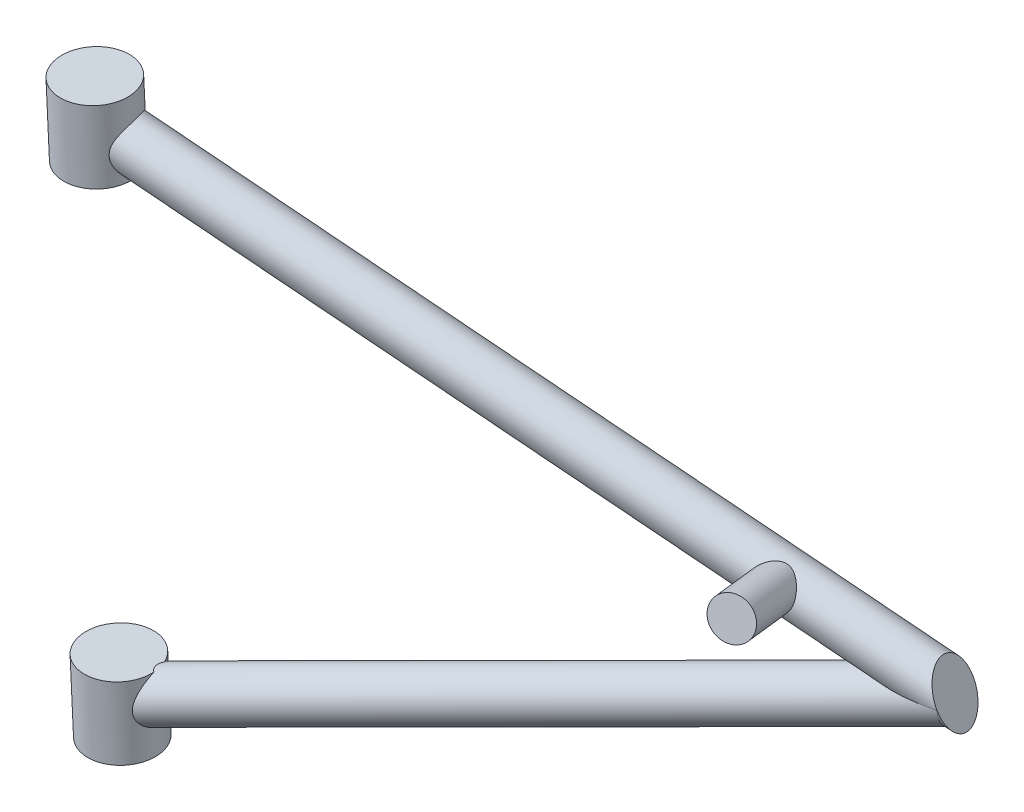
ISO-10303-21;
HEADER;
FILE_DESCRIPTION(('STEP AP214'),'2;1');
FILE_NAME('part.step','',(''),(''),'','','');
FILE_SCHEMA(('AUTOMOTIVE_DESIGN { 1 0 10303 214 1 1 1 1 }'));
ENDSEC;
DATA;
#1=APPLICATION_CONTEXT('core data for automotive mechanical design processes');
#2=APPLICATION_PROTOCOL_DEFINITION('international standard','automotive_design',2000,#1);
#3=PRODUCT_CONTEXT('',#1,'mechanical');
#4=PRODUCT('Part','Part','',(#3));
#5=PRODUCT_RELATED_PRODUCT_CATEGORY('part','',(#4));
#6=PRODUCT_DEFINITION_FORMATION('','',#4);
#7=PRODUCT_DEFINITION_CONTEXT('part definition',#1,'design');
#8=PRODUCT_DEFINITION('design','',#6,#7);
#9=PRODUCT_DEFINITION_SHAPE('','',#8);
#10=(LENGTH_UNIT() NAMED_UNIT(*) SI_UNIT(.MILLI.,.METRE.));
#11=(NAMED_UNIT(*) PLANE_ANGLE_UNIT() SI_UNIT($,.RADIAN.));
#12=(NAMED_UNIT(*) SI_UNIT($,.STERADIAN.) SOLID_ANGLE_UNIT());
#13=UNCERTAINTY_MEASURE_WITH_UNIT(LENGTH_MEASURE(1.E-05),#10,'distance_accuracy_value','');
#14=(GEOMETRIC_REPRESENTATION_CONTEXT(3) GLOBAL_UNCERTAINTY_ASSIGNED_CONTEXT((#13)) GLOBAL_UNIT_ASSIGNED_CONTEXT((#10,
#11,#12)) REPRESENTATION_CONTEXT('',''));
#15=CARTESIAN_POINT('',(0.,0.,0.));
#16=DIRECTION('',(0.,0.,1.));
#17=DIRECTION('',(1.,0.,0.));
#18=AXIS2_PLACEMENT_3D('',#15,#16,#17);
#19=CARTESIAN_POINT('',(255.,-221.47,-254.503));
#20=DIRECTION('',(0.912524270681738,0.366844617908996,-0.18089909266761));
#21=DIRECTION('',(-0.372998472957095,0.927831956321658,0.));
#22=AXIS2_PLACEMENT_3D('',#19,#20,#21);
#23=CYLINDRICAL_SURFACE('',#22,9.52500000000002);
#24=CARTESIAN_POINT('',(293.242179047782,-206.096230762816,-262.084141360994));
#25=DIRECTION('',(0.,0.998892249777093,0.0470560658710238));
#26=DIRECTION('',(0.977268280554209,0.00997618647777122,-0.211771536156257));
#27=AXIS2_PLACEMENT_3D('',#24,#25,#26);
#28=ELLIPSE('',#27,26.6116574264945,9.52500000000002);
#29=CARTESIAN_POINT('',(268.999181284131,-206.479491491884,-253.948395951266));
#30=VERTEX_POINT('',#29);
#31=CARTESIAN_POINT('',(267.803485256219,-206.220132528784,-259.453991316177));
#32=VERTEX_POINT('',#31);
#33=EDGE_CURVE('E105',#30,#32,#28,.F.);
#34=ORIENTED_EDGE('',*,*,#33,.F.);
#35=CARTESIAN_POINT('',(267.803485256219,-206.220132528784,-259.453991316177));
#36=CARTESIAN_POINT('',(267.697365527533,-206.314287046579,-259.698635479323));
#37=CARTESIAN_POINT('',(267.586764390849,-206.42159580225,-259.935753123484));
#38=CARTESIAN_POINT('',(267.3590656013,-206.659148812205,-260.394082141548));
#39=CARTESIAN_POINT('',(267.241984498495,-206.789336331361,-260.615330999056));
#40=CARTESIAN_POINT('',(266.886711742009,-207.206658583498,-261.250682509158));
#41=CARTESIAN_POINT('',(266.641879237606,-207.522929172958,-261.642177585505));
#42=CARTESIAN_POINT('',(266.235273501451,-208.092730241839,-262.239418803081));
#43=CARTESIAN_POINT('',(266.074316155262,-208.329666023735,-262.462324034543));
#44=CARTESIAN_POINT('',(265.753981376019,-208.824652753416,-262.884808049921));
#45=CARTESIAN_POINT('',(265.594604180185,-209.08270681934,-263.084383378549));
#46=CARTESIAN_POINT('',(265.279342301922,-209.618803267741,-263.462697257364));
#47=CARTESIAN_POINT('',(265.123488835937,-209.896969922729,-263.641284482501));
#48=CARTESIAN_POINT('',(264.819309695939,-210.469689099346,-263.97724993632));
#49=CARTESIAN_POINT('',(264.670983486587,-210.764240452564,-264.1346296746));
#50=CARTESIAN_POINT('',(264.381269831893,-211.376181258596,-264.432862120423));
#51=CARTESIAN_POINT('',(264.240163394191,-211.693965555147,-264.573178177829));
#52=CARTESIAN_POINT('',(263.973061649822,-212.344290165365,-264.832817021957));
#53=CARTESIAN_POINT('',(263.847070291525,-212.676834303664,-264.952134327155));
#54=CARTESIAN_POINT('',(263.615479530347,-213.35418344376,-265.169010362527));
#55=CARTESIAN_POINT('',(263.509796042121,-213.698930568173,-265.266659084283));
#56=CARTESIAN_POINT('',(263.323918613269,-214.40060892788,-265.439720146905));
#57=CARTESIAN_POINT('',(263.243704957851,-214.757530501437,-265.515149683131));
#58=CARTESIAN_POINT('',(263.140757197253,-215.337931157684,-265.616682171021));
#59=CARTESIAN_POINT('',(263.107839746575,-215.558288084853,-265.650490284906));
#60=CARTESIAN_POINT('',(263.055221234641,-216.001787504313,-265.708623035463));
#61=CARTESIAN_POINT('',(263.035515613435,-216.224929008417,-265.732950942932));
#62=CARTESIAN_POINT('',(263.010753298342,-216.6726776378,-265.771379849267));
#63=CARTESIAN_POINT('',(263.005680130779,-216.897282829338,-265.785492335551));
#64=CARTESIAN_POINT('',(263.011298244634,-217.346752682923,-265.80274430895));
#65=CARTESIAN_POINT('',(263.021989511733,-217.571617344735,-265.805883806031));
#66=CARTESIAN_POINT('',(263.059984423546,-218.021655112976,-265.800397176217));
#67=CARTESIAN_POINT('',(263.0874217406,-218.246816002228,-265.791675675815));
#68=CARTESIAN_POINT('',(263.159066383468,-218.693611930885,-265.761625241399));
#69=CARTESIAN_POINT('',(263.203273557364,-218.915247002211,-265.740296421595));
#70=CARTESIAN_POINT('',(263.30776437712,-219.353093275263,-265.684545181846));
#71=CARTESIAN_POINT('',(263.368053812421,-219.569302493014,-265.650118044742));
#72=CARTESIAN_POINT('',(263.503297097006,-219.994461443992,-265.567923797466));
#73=CARTESIAN_POINT('',(263.578250721479,-220.203411288453,-265.520156891796));
#74=CARTESIAN_POINT('',(263.733171590505,-220.593225138195,-265.416430865558));
#75=CARTESIAN_POINT('',(263.811987994475,-220.774872676237,-265.36167938882));
#76=CARTESIAN_POINT('',(263.978462432031,-221.130423154988,-265.241300951544));
#77=CARTESIAN_POINT('',(264.06612389616,-221.3043230528,-265.175669764933));
#78=CARTESIAN_POINT('',(264.24857889433,-221.643813586958,-265.03371158526));
#79=CARTESIAN_POINT('',(264.343372946659,-221.80940361801,-264.957383814584));
#80=CARTESIAN_POINT('',(264.538437505506,-222.131975916435,-264.794240719237));
#81=CARTESIAN_POINT('',(264.638708684581,-222.288957121931,-264.707424105006));
#82=CARTESIAN_POINT('',(264.856080793585,-222.613432512373,-264.511904137335));
#83=CARTESIAN_POINT('',(264.973706227715,-222.77974489652,-264.401821371604));
#84=CARTESIAN_POINT('',(265.211812817542,-223.101071675487,-264.168997659305));
#85=CARTESIAN_POINT('',(265.332294133555,-223.25608543406,-264.046256000829));
#86=CARTESIAN_POINT('',(265.574267969116,-223.554796284649,-263.788422034612));
#87=CARTESIAN_POINT('',(265.695760939554,-223.698487995004,-263.653323918668));
#88=CARTESIAN_POINT('',(265.937968608628,-223.9743822208,-263.371221770743));
#89=CARTESIAN_POINT('',(266.058683267141,-224.106584148258,-263.224217130196));
#90=CARTESIAN_POINT('',(266.316388873185,-224.379086894282,-262.894911525225));
#91=CARTESIAN_POINT('',(266.452983883531,-224.517438018628,-262.710680519274));
#92=CARTESIAN_POINT('',(266.720771944835,-224.778357387148,-262.327661237535));
#93=CARTESIAN_POINT('',(266.851964487,-224.900924147083,-262.128871595517));
#94=CARTESIAN_POINT('',(267.106914603057,-225.129934865831,-261.717650437763));
#95=CARTESIAN_POINT('',(267.230671343288,-225.236377018868,-261.505217397907));
#96=CARTESIAN_POINT('',(267.468876424041,-225.43271743723,-261.067853372235));
#97=CARTESIAN_POINT('',(267.583325023973,-225.522616163696,-260.842922735012));
#98=CARTESIAN_POINT('',(267.802315193678,-225.686237507517,-260.379654071813));
#99=CARTESIAN_POINT('',(267.906750630271,-225.759795842173,-260.141207706006));
#100=CARTESIAN_POINT('',(268.102975695885,-225.889205563581,-259.654493838866));
#101=CARTESIAN_POINT('',(268.194765111246,-225.945056651182,-259.406226171689));
#102=CARTESIAN_POINT('',(268.36445666864,-226.038678078082,-258.901741183751));
#103=CARTESIAN_POINT('',(268.44236278672,-226.076453599294,-258.645526163796));
#104=CARTESIAN_POINT('',(268.583397962621,-226.133680431828,-258.127059212255));
#105=CARTESIAN_POINT('',(268.646527716311,-226.15313260619,-257.864807565594));
#106=CARTESIAN_POINT('',(268.75456089052,-226.173041180107,-257.350001463026));
#107=CARTESIAN_POINT('',(268.800236085503,-226.17442507342,-257.097643977992));
#108=CARTESIAN_POINT('',(268.87754495621,-226.160559049983,-256.591249747588));
#109=CARTESIAN_POINT('',(268.909179149581,-226.145309746517,-256.337213064475));
#110=CARTESIAN_POINT('',(268.958465129282,-226.098254186145,-255.829342197431));
#111=CARTESIAN_POINT('',(268.97611791716,-226.066449115471,-255.575508000297));
#112=CARTESIAN_POINT('',(268.997780159279,-225.986437433502,-255.06985384672));
#113=CARTESIAN_POINT('',(269.001789410141,-225.938230577724,-254.818033920359));
#114=CARTESIAN_POINT('',(268.996762287689,-225.825707993507,-254.318544779101));
#115=CARTESIAN_POINT('',(268.987744850636,-225.761415759862,-254.070870067635));
#116=CARTESIAN_POINT('',(268.957530962621,-225.616923119472,-253.580973567274));
#117=CARTESIAN_POINT('',(268.936334552204,-225.536722765687,-253.338751760229));
#118=CARTESIAN_POINT('',(268.882802768389,-225.360597511825,-252.861222854839));
#119=CARTESIAN_POINT('',(268.850461702744,-225.264664589324,-252.625919356878));
#120=CARTESIAN_POINT('',(268.775907958965,-225.057297669075,-252.163861958913));
#121=CARTESIAN_POINT('',(268.733694983814,-224.94586320497,-251.937108316386));
#122=CARTESIAN_POINT('',(268.638427804418,-224.70137759742,-251.481962002));
#123=CARTESIAN_POINT('',(268.584920879624,-224.567498865722,-251.254107944126));
#124=CARTESIAN_POINT('',(268.470559133134,-224.282804564353,-250.811147094706));
#125=CARTESIAN_POINT('',(268.409703629115,-224.13198742202,-250.596041489638));
#126=CARTESIAN_POINT('',(268.282914006161,-223.81350185564,-250.180367343564));
#127=CARTESIAN_POINT('',(268.21698123708,-223.645837906937,-249.979794966055));
#128=CARTESIAN_POINT('',(268.082581578995,-223.293675776162,-249.59495297393));
#129=CARTESIAN_POINT('',(268.014115195036,-223.109180938497,-249.410680134762));
#130=CARTESIAN_POINT('',(267.889441483938,-222.757180467935,-249.090924796078));
#131=CARTESIAN_POINT('',(267.83317936084,-222.592326466294,-248.952538990793));
#132=CARTESIAN_POINT('',(267.722651266223,-222.25151404732,-248.689326778223));
#133=CARTESIAN_POINT('',(267.668384903767,-222.075557823276,-248.564497705929));
#134=CARTESIAN_POINT('',(267.563747133932,-221.713228224221,-248.329677098308));
#135=CARTESIAN_POINT('',(267.513370789218,-221.526868589261,-248.219666618114));
#136=CARTESIAN_POINT('',(267.4182587498,-221.144323935223,-248.015368122386));
#137=CARTESIAN_POINT('',(267.373523009128,-220.948138996235,-247.92107997872));
#138=CARTESIAN_POINT('',(267.291137225037,-220.546013503638,-247.748638257899));
#139=CARTESIAN_POINT('',(267.2535278762,-220.340024858359,-247.670577111481));
#140=CARTESIAN_POINT('',(267.187082074715,-219.920901255214,-247.531833206973));
#141=CARTESIAN_POINT('',(267.158245482821,-219.707766410837,-247.471150173047));
#142=CARTESIAN_POINT('',(267.110235562994,-219.276173299073,-247.367297249279));
#143=CARTESIAN_POINT('',(267.091064070753,-219.05771402867,-247.324130686644));
#144=CARTESIAN_POINT('',(267.062724596509,-218.617469337366,-247.255007864885));
#145=CARTESIAN_POINT('',(267.053556655437,-218.395683902859,-247.229051676181));
#146=CARTESIAN_POINT('',(267.045348670539,-217.968250588951,-247.19502778059));
#147=CARTESIAN_POINT('',(267.045565007181,-217.762713603364,-247.185707712271));
#148=CARTESIAN_POINT('',(267.053792930777,-217.351595295943,-247.180270105336));
#149=CARTESIAN_POINT('',(267.061807327794,-217.146013984837,-247.184157327279));
#150=CARTESIAN_POINT('',(267.096519483449,-216.530787761495,-247.214349430058));
#151=CARTESIAN_POINT('',(267.133884626441,-216.122537567518,-247.259176045046));
#152=CARTESIAN_POINT('',(267.222325638461,-215.381368977004,-247.380627271946));
#153=CARTESIAN_POINT('',(267.270207937088,-215.046942942879,-247.450938854214));
#154=CARTESIAN_POINT('',(267.377018936706,-214.386439361572,-247.618189330147));
#155=CARTESIAN_POINT('',(267.435954174913,-214.060366885459,-247.71514399763));
#156=CARTESIAN_POINT('',(267.561389779737,-213.416716646475,-247.9336507454));
#157=CARTESIAN_POINT('',(267.627918198398,-213.099176112066,-248.055295417468));
#158=CARTESIAN_POINT('',(267.765029228637,-212.474758490432,-248.321306075396));
#159=CARTESIAN_POINT('',(267.835611193412,-212.167879714442,-248.465668442679));
#160=CARTESIAN_POINT('',(267.980843351858,-211.553014635479,-248.782694691098));
#161=CARTESIAN_POINT('',(268.0555401776,-211.245519516577,-248.956290190469));
#162=CARTESIAN_POINT('',(268.202991109672,-210.644308733987,-249.32672039377));
#163=CARTESIAN_POINT('',(268.275745048135,-210.350594259308,-249.523557097843));
#164=CARTESIAN_POINT('',(268.415818484292,-209.780532346564,-249.939235286135));
#165=CARTESIAN_POINT('',(268.483167743511,-209.504091965957,-250.15793886129));
#166=CARTESIAN_POINT('',(268.609798910895,-208.969228518461,-250.618611208845));
#167=CARTESIAN_POINT('',(268.669081435061,-208.710804076553,-250.860578202365));
#168=CARTESIAN_POINT('',(268.765852461967,-208.26341636258,-251.318946387353));
#169=CARTESIAN_POINT('',(268.805338585521,-208.070684366789,-251.531243647368));
#170=CARTESIAN_POINT('',(268.874936386724,-207.701749340829,-251.970974377624));
#171=CARTESIAN_POINT('',(268.905055549102,-207.525533192642,-252.198395585667));
#172=CARTESIAN_POINT('',(268.95419156177,-207.190432647219,-252.670920659274));
#173=CARTESIAN_POINT('',(268.973077255322,-207.031769957774,-252.916197267341));
#174=CARTESIAN_POINT('',(268.997070890751,-206.73735109464,-253.421580500344));
#175=CARTESIAN_POINT('',(269.002142266349,-206.601656605006,-253.681724626914));
#176=CARTESIAN_POINT('',(268.999181284131,-206.479491491884,-253.948395951266));
#177=B_SPLINE_CURVE_WITH_KNOTS('',3,(#35,#36,#37,#38,#39,#40,#41,#42,#43,#44,#45,#46,#47,#48,
#49,#50,#51,#52,#53,#54,#55,#56,#57,#58,#59,#60,#61,#62,#63,#64,#65,#66,#67,#68,#69,#70,#71,#72,
#73,#74,#75,#76,#77,#78,#79,#80,#81,#82,#83,#84,#85,#86,#87,#88,#89,#90,#91,#92,#93,#94,#95,#96,
#97,#98,#99,#100,#101,#102,#103,#104,#105,#106,#107,#108,#109,#110,#111,#112,#113,#114,#115,
#116,#117,#118,#119,#120,#121,#122,#123,#124,#125,#126,#127,#128,#129,#130,#131,#132,#133,#134,
#135,#136,#137,#138,#139,#140,#141,#142,#143,#144,#145,#146,#147,#148,#149,#150,#151,#152,#153,
#154,#155,#156,#157,#158,#159,#160,#161,#162,#163,#164,#165,#166,#167,#168,#169,#170,#171,#172,
#173,#174,#175,#176),.UNSPECIFIED.,.F.,.F.,(4,2,2,2,2,2,2,2,2,2,2,2,2,2,2,2,2,2,2,2,2,2,2,2,2,2,
2,2,2,2,2,2,2,2,2,2,2,2,2,2,2,2,2,2,2,2,2,2,2,2,2,2,2,2,2,2,2,2,2,2,2,2,2,2,2,2,2,2,2,2,4),(0.,
0.847248957157209,1.69242580052789,3.3627657640452,4.45048572585789,5.53836658145481,
6.63366380567474,7.7288830228253,8.85260269563985,9.97661527103477,11.0958685200099,
12.214253292855,12.8897999019046,13.5651132316117,14.2396659749776,14.9142181056374,
15.594226457347,16.2742286490018,16.9544759652561,17.6347128537404,18.2503947330981,
18.8663163283093,19.4822827225457,20.0983249244541,20.7922888745161,21.4862918728688,
22.1806227833065,22.8749892047906,23.6775899204243,24.4802660513897,25.2830320066978,
26.0857755818625,26.8962571907386,27.7067524913827,28.517015299415,29.3272399417498,
30.0956997057354,30.8641311366941,31.6325075166236,32.4008953503885,33.1681673395538,
33.935436774422,34.7030986823461,35.4707836899619,36.2787608460513,37.0868130815586,
37.8946512231765,38.7023291903113,39.3690957519282,40.0357310011377,40.7015057318462,
41.3672750364114,42.0367385694382,42.7061914757579,43.3757714834116,44.0453542307185,
44.6619834053258,45.2788348670851,46.5121712393655,47.5460979811356,48.580638174395,
49.6191322393976,50.6574610554916,51.7392464537718,52.8211250187368,53.8965658681635,
54.9719245473783,55.8393415741109,56.7060636942321,57.5827161452231,58.4616868366877),.UNSPECIFIED.);
#178=EDGE_CURVE('E92',#32,#30,#177,.T.);
#179=ORIENTED_EDGE('',*,*,#178,.F.);
#180=EDGE_LOOP('',(#34,#179));
#181=FACE_BOUND('',#180,.T.);
#182=CARTESIAN_POINT('',(536.966082,-108.116588,-310.400043));
#183=DIRECTION('',(0.977042799081254,0.0314302037809526,-0.210711914835768));
#184=DIRECTION('',(-0.0209918277884314,0.998447490299481,0.0515941109116967));
#185=AXIS2_PLACEMENT_3D('',#182,#183,#184);
#186=ELLIPSE('',#185,10.1198136751925,9.525);
#187=CARTESIAN_POINT('',(538.985442921555,-108.554608710622,-301.10187413051));
#188=VERTEX_POINT('',#187);
#189=CARTESIAN_POINT('',(534.946721078445,-107.678567289377,-319.69821186949));
#190=VERTEX_POINT('',#189);
#191=EDGE_CURVE('E99',#188,#190,#186,.T.);
#192=ORIENTED_EDGE('',*,*,#191,.F.);
#193=CARTESIAN_POINT('',(536.966082,-108.116588,-310.400043));
#194=DIRECTION('',(-0.0209918277884314,0.998447490299481,0.0515941109116967));
#195=DIRECTION('',(0.977042799081254,0.0314302037809526,-0.210711914835768));
#196=AXIS2_PLACEMENT_3D('',#193,#194,#195);
#197=ELLIPSE('',#196,28.1983093968674,9.525);
#198=EDGE_CURVE('E127',#190,#188,#197,.T.);
#199=ORIENTED_EDGE('',*,*,#198,.F.);
#200=EDGE_LOOP('',(#192,#199));
#201=FACE_BOUND('',#200,.T.);
#202=ADVANCED_FACE('F73',(#181,#201),#23,.T.);
#203=CARTESIAN_POINT('',(255.,-14.5,-244.753));
#204=DIRECTION('',(0.926705770492292,-0.307678965136663,-0.215754650815965));
#205=DIRECTION('',(0.31510033175296,0.949058365396552,0.));
#206=AXIS2_PLACEMENT_3D('',#203,#204,#205);
#207=CYLINDRICAL_SURFACE('',#206,9.52499999999998);
#208=CARTESIAN_POINT('',(491.559376526952,-87.8011749957576,-291.143917889079));
#209=CARTESIAN_POINT('',(491.529662717759,-87.5916495535499,-291.241884142793));
#210=CARTESIAN_POINT('',(491.488971320495,-87.3852694914071,-291.343081063884));
#211=CARTESIAN_POINT('',(491.387180046598,-86.9800347739609,-291.550362071812));
#212=CARTESIAN_POINT('',(491.326070632284,-86.7811836840161,-291.656448422601));
#213=CARTESIAN_POINT('',(491.185020265176,-86.3918297174516,-291.872007838131));
#214=CARTESIAN_POINT('',(491.105052009127,-86.2013394241212,-291.981485611356));
#215=CARTESIAN_POINT('',(490.927985751368,-85.8296081692735,-292.202151415337));
#216=CARTESIAN_POINT('',(490.830889539516,-85.6483662438573,-292.313339266285));
#217=CARTESIAN_POINT('',(490.62222866022,-85.2973230114299,-292.534764304513));
#218=CARTESIAN_POINT('',(490.510834749183,-85.1274178531025,-292.644998508437));
#219=CARTESIAN_POINT('',(490.274037190037,-84.796914796182,-292.864378148927));
#220=CARTESIAN_POINT('',(490.14863185298,-84.63631802318,-292.973523452506));
#221=CARTESIAN_POINT('',(489.884605387124,-84.3239764114477,-293.189553806048));
#222=CARTESIAN_POINT('',(489.745954942547,-84.1722524654602,-293.296433171071));
#223=CARTESIAN_POINT('',(489.456605071716,-83.8778649070947,-293.506103822704));
#224=CARTESIAN_POINT('',(489.305909079661,-83.7351987330014,-293.608896262075));
#225=CARTESIAN_POINT('',(488.961306051175,-83.4304515296713,-293.828977135117));
#226=CARTESIAN_POINT('',(488.764839936299,-83.2703142658239,-293.944968143615));
#227=CARTESIAN_POINT('',(488.356077061383,-82.9619496657208,-294.164771963792));
#228=CARTESIAN_POINT('',(488.143769692789,-82.8137304512764,-294.268576492525));
#229=CARTESIAN_POINT('',(487.704910898622,-82.5293506071681,-294.458304876902));
#230=CARTESIAN_POINT('',(487.478421565805,-82.3931429452947,-294.544300429618));
#231=CARTESIAN_POINT('',(487.011625074701,-82.1320807995175,-294.691677252016));
#232=CARTESIAN_POINT('',(486.771340762152,-82.0072083810916,-294.753097947784));
#233=CARTESIAN_POINT('',(486.287095716625,-81.7731560937532,-294.840396688129));
#234=CARTESIAN_POINT('',(486.043556762472,-81.6635803770521,-294.867441587034));
#235=CARTESIAN_POINT('',(485.673811815002,-81.5088145792904,-294.877304812153));
#236=CARTESIAN_POINT('',(485.549934977805,-81.4588653356094,-294.875490251306));
#237=CARTESIAN_POINT('',(485.301510990175,-81.3624374832111,-294.86080993212));
#238=CARTESIAN_POINT('',(485.176964173508,-81.3159572920247,-294.847949246569));
#239=CARTESIAN_POINT('',(484.927333791818,-81.2265113135014,-294.810542210151));
#240=CARTESIAN_POINT('',(484.802252722586,-81.1835729172014,-294.785913275721));
#241=CARTESIAN_POINT('',(484.553557625501,-81.1019596562844,-294.724977158161));
#242=CARTESIAN_POINT('',(484.429943565202,-81.063284697214,-294.688670233819));
#243=CARTESIAN_POINT('',(484.185000450688,-80.9904620114323,-294.604920173416));
#244=CARTESIAN_POINT('',(484.063674570351,-80.9563202256519,-294.557462645097));
#245=CARTESIAN_POINT('',(483.824129197936,-80.8928148151928,-294.452456979862));
#246=CARTESIAN_POINT('',(483.705911472504,-80.8634538606812,-294.394903241081));
#247=CARTESIAN_POINT('',(483.440101976822,-80.8020199224207,-294.253474469908));
#248=CARTESIAN_POINT('',(483.293656943508,-80.7715278305907,-294.166758543848));
#249=CARTESIAN_POINT('',(483.006789780605,-80.7186258530364,-293.981652256896));
#250=CARTESIAN_POINT('',(482.86637115991,-80.6962206211286,-293.883255216914));
#251=CARTESIAN_POINT('',(482.590936699957,-80.6593668805657,-293.677108112963));
#252=CARTESIAN_POINT('',(482.455936399355,-80.644939923312,-293.569333617004));
#253=CARTESIAN_POINT('',(482.191236886034,-80.6240254712716,-293.346841168523));
#254=CARTESIAN_POINT('',(482.061536908102,-80.6175368264823,-293.232124224263));
#255=CARTESIAN_POINT('',(481.731863658329,-80.6109013002335,-292.928461372541));
#256=CARTESIAN_POINT('',(481.535418481686,-80.6167277712644,-292.735535810711));
#257=CARTESIAN_POINT('',(481.15214978719,-80.6481352206751,-292.341839547689));
#258=CARTESIAN_POINT('',(480.965331449687,-80.6737267189143,-292.141064722801));
#259=CARTESIAN_POINT('',(480.599686541369,-80.7450289863799,-291.735395424181));
#260=CARTESIAN_POINT('',(480.420869997972,-80.7907642616079,-291.530496223566));
#261=CARTESIAN_POINT('',(480.070669784251,-80.9029491379707,-291.120084074986));
#262=CARTESIAN_POINT('',(479.899284640828,-80.9693946122205,-290.914571257368));
#263=CARTESIAN_POINT('',(479.559288110073,-81.1258089923834,-290.500486257974));
#264=CARTESIAN_POINT('',(479.390863450141,-81.2163424454195,-290.291972646799));
#265=CARTESIAN_POINT('',(479.061770392193,-81.4210617258959,-289.880357837717));
#266=CARTESIAN_POINT('',(478.901103487787,-81.5352520858151,-289.677257685414));
#267=CARTESIAN_POINT('',(478.588880739246,-81.7878214924124,-289.280391320885));
#268=CARTESIAN_POINT('',(478.437299386165,-81.9261280988021,-289.086599311592));
#269=CARTESIAN_POINT('',(478.144168877816,-82.2277781069857,-288.711357567254));
#270=CARTESIAN_POINT('',(478.002613562744,-82.3911059376421,-288.529900256817));
#271=CARTESIAN_POINT('',(477.777434826324,-82.683111045496,-288.2420690728));
#272=CARTESIAN_POINT('',(477.690456030669,-82.8047333646322,-288.131115157504));
#273=CARTESIAN_POINT('',(477.522305587953,-83.0587313296795,-287.917447956792));
#274=CARTESIAN_POINT('',(477.441132333604,-83.1911039774739,-287.814732389591));
#275=CARTESIAN_POINT('',(477.285295227857,-83.466160064598,-287.618752920624));
#276=CARTESIAN_POINT('',(477.210628031528,-83.6088381358067,-287.525484157959));
#277=CARTESIAN_POINT('',(477.068442067385,-83.9039394425668,-287.349461136487));
#278=CARTESIAN_POINT('',(477.000923542022,-84.0563630083596,-287.266707234277));
#279=CARTESIAN_POINT('',(476.873392929721,-84.3708204358828,-287.11236306563));
#280=CARTESIAN_POINT('',(476.813418921722,-84.5328974063419,-287.040829013308));
#281=CARTESIAN_POINT('',(476.701961306542,-84.8648270163088,-286.910262254382));
#282=CARTESIAN_POINT('',(476.650477666852,-85.0346796260413,-286.85122949991));
#283=CARTESIAN_POINT('',(476.556480589445,-85.380787277763,-286.746271199874));
#284=CARTESIAN_POINT('',(476.513966781138,-85.5570420548937,-286.700345112779));
#285=CARTESIAN_POINT('',(476.438233147499,-85.9144565064588,-286.621914206786));
#286=CARTESIAN_POINT('',(476.405012947872,-86.095615983037,-286.58940884735));
#287=CARTESIAN_POINT('',(476.35009657235,-86.4479758877435,-286.539707694216));
#288=CARTESIAN_POINT('',(476.327737864052,-86.6189420886509,-286.521570198422));
#289=CARTESIAN_POINT('',(476.291137989845,-86.962612616593,-286.496630473731));
#290=CARTESIAN_POINT('',(476.276899559136,-87.1353175093712,-286.489832062763));
#291=CARTESIAN_POINT('',(476.25645461464,-87.4812189362349,-286.487198594878));
#292=CARTESIAN_POINT('',(476.250245630938,-87.6544153027028,-286.491360165399));
#293=CARTESIAN_POINT('',(476.245667597994,-88.0003934109197,-286.510113541737));
#294=CARTESIAN_POINT('',(476.247301483113,-88.1731749732789,-286.524709249685));
#295=CARTESIAN_POINT('',(476.25857715203,-88.5298966641269,-286.56512798596));
#296=CARTESIAN_POINT('',(476.268792347303,-88.713735048253,-286.591689948874));
#297=CARTESIAN_POINT('',(476.297654510581,-89.0789533351154,-286.655239719964));
#298=CARTESIAN_POINT('',(476.316304815966,-89.2603322354642,-286.692231652609));
#299=CARTESIAN_POINT('',(476.384435712415,-89.7997130352529,-286.817552533178));
#300=CARTESIAN_POINT('',(476.446097664501,-90.1529987696871,-286.920231397726));
#301=CARTESIAN_POINT('',(476.579732677055,-90.7530836104087,-287.125910474927));
#302=CARTESIAN_POINT('',(476.644964482172,-91.0038823252669,-287.222022760352));
#303=CARTESIAN_POINT('',(476.791472201007,-91.4948100627236,-287.428330320772));
#304=CARTESIAN_POINT('',(476.872748598647,-91.7349387632359,-287.538526020501));
#305=CARTESIAN_POINT('',(477.051381608124,-92.204087415565,-287.770346894746));
#306=CARTESIAN_POINT('',(477.148773283863,-92.433081703379,-287.891996737008));
#307=CARTESIAN_POINT('',(477.359896943218,-92.8786060119323,-288.143508318568));
#308=CARTESIAN_POINT('',(477.473623923561,-93.0951398208011,-288.273367536657));
#309=CARTESIAN_POINT('',(477.692356486259,-93.4700346249142,-288.50969840808));
#310=CARTESIAN_POINT('',(477.794030622675,-93.6309372067891,-288.615236357212));
#311=CARTESIAN_POINT('',(478.009104580202,-93.9439823060183,-288.827465963844));
#312=CARTESIAN_POINT('',(478.122505837142,-94.0961237471286,-288.934157761183));
#313=CARTESIAN_POINT('',(478.361988041074,-94.3904220924086,-289.14610940149));
#314=CARTESIAN_POINT('',(478.488037154309,-94.5326026067615,-289.251372118356));
#315=CARTESIAN_POINT('',(478.754439984606,-94.8060016979438,-289.457721239517));
#316=CARTESIAN_POINT('',(478.894785234898,-94.937226680258,-289.558810066477));
#317=CARTESIAN_POINT('',(479.230607343203,-95.2197992678194,-289.778737922952));
#318=CARTESIAN_POINT('',(479.430894002489,-95.36740902499,-289.895286794498));
#319=CARTESIAN_POINT('',(479.75139600687,-95.5692074665184,-290.053639848067));
#320=CARTESIAN_POINT('',(479.861496746794,-95.6331687946817,-290.10365180516));
#321=CARTESIAN_POINT('',(480.088251966889,-95.7538303805402,-290.197078946736));
#322=CARTESIAN_POINT('',(480.204903100169,-95.8105342986683,-290.240497458845));
#323=CARTESIAN_POINT('',(480.445357206288,-95.9164337660122,-290.320129744573));
#324=CARTESIAN_POINT('',(480.569216323894,-95.965555060406,-290.356273205518));
#325=CARTESIAN_POINT('',(480.82214213217,-96.0550508004305,-290.420197940079));
#326=CARTESIAN_POINT('',(480.951208604613,-96.0954256121564,-290.447979563708));
#327=CARTESIAN_POINT('',(481.21343249747,-96.1671433517034,-290.495051451251));
#328=CARTESIAN_POINT('',(481.346592876144,-96.1984795700118,-290.51433541277));
#329=CARTESIAN_POINT('',(481.615685333075,-96.2521138303033,-290.544759820274));
#330=CARTESIAN_POINT('',(481.751618928453,-96.274406777802,-290.555895678894));
#331=CARTESIAN_POINT('',(482.053442419951,-96.3139523740871,-290.572321794249));
#332=CARTESIAN_POINT('',(482.219686325465,-96.3291943829658,-290.575916012345));
#333=CARTESIAN_POINT('',(482.552804726166,-96.3477508561205,-290.574103761442));
#334=CARTESIAN_POINT('',(482.719679507322,-96.3510590351024,-290.568692551668));
#335=CARTESIAN_POINT('',(483.053327795325,-96.3467091473105,-290.550738468352));
#336=CARTESIAN_POINT('',(483.220099725691,-96.339020512677,-290.538175774318));
#337=CARTESIAN_POINT('',(483.55231130152,-96.313542564656,-290.507674146539));
#338=CARTESIAN_POINT('',(483.717751095755,-96.2957543954993,-290.489735821937));
#339=CARTESIAN_POINT('',(484.146515549189,-96.2372747806051,-290.438026235551));
#340=CARTESIAN_POINT('',(484.408486841328,-96.1892375168419,-290.401242990613));
#341=CARTESIAN_POINT('',(484.926838320394,-96.0715190713951,-290.322978226695));
#342=CARTESIAN_POINT('',(485.183215271445,-96.0018257008969,-290.281494070251));
#343=CARTESIAN_POINT('',(485.689781787371,-95.8421521845459,-290.197660638338));
#344=CARTESIAN_POINT('',(485.939963118802,-95.7521464988025,-290.155310335305));
#345=CARTESIAN_POINT('',(486.432806091734,-95.5527609760997,-290.072891853232));
#346=CARTESIAN_POINT('',(486.675469260758,-95.4433851054668,-290.032823209204));
#347=CARTESIAN_POINT('',(487.16061610316,-95.2014531765174,-289.956194521309));
#348=CARTESIAN_POINT('',(487.402786814468,-95.0682113780285,-289.919809811539));
#349=CARTESIAN_POINT('',(487.876131257919,-94.7816249789844,-289.854762610711));
#350=CARTESIAN_POINT('',(488.107302957178,-94.6282766817798,-289.82610154264));
#351=CARTESIAN_POINT('',(488.555737999741,-94.3021537612344,-289.778905326127));
#352=CARTESIAN_POINT('',(488.773036233958,-94.1294311478624,-289.760343814758));
#353=CARTESIAN_POINT('',(489.191510654677,-93.7646974537933,-289.735424174066));
#354=CARTESIAN_POINT('',(489.392695448648,-93.5726967962433,-289.729059487226));
#355=CARTESIAN_POINT('',(489.714911548085,-93.2341298903662,-289.730285006306));
#356=CARTESIAN_POINT('',(489.841132360932,-93.0924585737388,-289.734090613145));
#357=CARTESIAN_POINT('',(490.08335556757,-92.8010075334428,-289.748877270911));
#358=CARTESIAN_POINT('',(490.199360694512,-92.6512299959694,-289.759856395945));
#359=CARTESIAN_POINT('',(490.419912017537,-92.3442593497812,-289.789458785498));
#360=CARTESIAN_POINT('',(490.524463101845,-92.1870694457237,-289.808078772909));
#361=CARTESIAN_POINT('',(490.720960945414,-91.8660722569132,-289.853311127781));
#362=CARTESIAN_POINT('',(490.812907415532,-91.70226482047,-289.87992367854));
#363=CARTESIAN_POINT('',(490.983569906246,-91.3681291801087,-289.941510582738));
#364=CARTESIAN_POINT('',(491.062203832284,-91.197767939093,-289.976533813158));
#365=CARTESIAN_POINT('',(491.204585676302,-90.8527647965151,-290.054847522082));
#366=CARTESIAN_POINT('',(491.268333275069,-90.6781228032474,-290.098138177832));
#367=CARTESIAN_POINT('',(491.380170005134,-90.3261119600862,-290.192742004001));
#368=CARTESIAN_POINT('',(491.42826704538,-90.1487445350853,-290.244051102865));
#369=CARTESIAN_POINT('',(491.50841077232,-89.7928075717494,-290.35424384309));
#370=CARTESIAN_POINT('',(491.540459973285,-89.6142382261694,-290.413126296089));
#371=CARTESIAN_POINT('',(491.601549104927,-89.1593472500972,-290.572145575325));
#372=CARTESIAN_POINT('',(491.619290368894,-88.8831469306159,-290.677191832049));
#373=CARTESIAN_POINT('',(491.617013114659,-88.3366755408077,-290.901071314317));
#374=CARTESIAN_POINT('',(491.596990093341,-88.066405181473,-291.019906182469));
#375=CARTESIAN_POINT('',(491.559376526952,-87.8011749957576,-291.143917889079));
#376=B_SPLINE_CURVE_WITH_KNOTS('',3,(#208,#209,#210,#211,#212,#213,#214,#215,#216,#217,#218,
#219,#220,#221,#222,#223,#224,#225,#226,#227,#228,#229,#230,#231,#232,#233,#234,#235,#236,#237,
#238,#239,#240,#241,#242,#243,#244,#245,#246,#247,#248,#249,#250,#251,#252,#253,#254,#255,#256,
#257,#258,#259,#260,#261,#262,#263,#264,#265,#266,#267,#268,#269,#270,#271,#272,#273,#274,#275,
#276,#277,#278,#279,#280,#281,#282,#283,#284,#285,#286,#287,#288,#289,#290,#291,#292,#293,#294,
#295,#296,#297,#298,#299,#300,#301,#302,#303,#304,#305,#306,#307,#308,#309,#310,#311,#312,#313,
#314,#315,#316,#317,#318,#319,#320,#321,#322,#323,#324,#325,#326,#327,#328,#329,#330,#331,#332,
#333,#334,#335,#336,#337,#338,#339,#340,#341,#342,#343,#344,#345,#346,#347,#348,#349,#350,#351,
#352,#353,#354,#355,#356,#357,#358,#359,#360,#361,#362,#363,#364,#365,#366,#367,#368,#369,#370,
#371,#372,#373,#374,#375),.UNSPECIFIED.,.T.,.F.,(4,2,2,2,2,2,2,2,2,2,2,2,2,2,2,2,2,2,2,2,2,2,2,
2,2,2,2,2,2,2,2,2,2,2,2,2,2,2,2,2,2,2,2,2,2,2,2,2,2,2,2,2,2,2,2,2,2,2,2,2,2,2,2,2,2,2,2,2,2,2,2,
2,2,2,2,2,2,2,2,2,2,2,2,4),(0.,0.699212645931602,1.39875236629851,2.09931114456156,
2.79979675826214,3.49258315787538,4.18545315676309,4.87989389588555,5.57413735054372,
6.40941764637191,7.24526242094921,8.07767378876947,8.90874429022027,9.71077780789862,
10.1110910058098,10.5112204633493,10.9142000110911,11.317170629301,11.7206642531769,
12.1243824670838,12.6422630907604,13.1604412703545,13.6800124311735,14.1995083141471,
15.0245044216311,15.8499399329744,16.6763824172583,17.5026603229707,18.3503331702771,
19.1981685755322,20.0434997999882,20.888307081417,21.4463730536193,22.0042839199812,
22.5619062364237,23.119547458801,23.6798990146921,24.2402484250046,24.8005746799144,
25.3608783647659,25.8804216599853,26.40013985284,26.9196981387491,27.4394508293751,
27.996981032224,28.5547320170565,29.6701148926777,30.4983510567784,31.3266122051359,
32.1566997850526,32.986533660876,33.638999580339,34.2915454803932,34.942488313198,
35.5930478474831,36.41408296832,36.8240643149718,37.2338380568039,37.6473998439842,
38.0609443176596,38.4747949875184,38.8888784755287,39.3890269682498,39.8894388401011,
40.3912444139678,40.8929931469124,41.6983911133915,42.5042432096264,43.3111142537487,
44.1178202699477,44.9532001812194,45.788733895912,46.6220760197351,47.4549699784495,
48.023796324583,48.5924700190635,49.1609000682081,49.7293431545756,50.3011731694992,
50.8730154453117,51.4445682924395,52.0160315643102,52.9010323803669,53.7861387329935),.UNSPECIFIED.);
#377=CARTESIAN_POINT('',(491.559376526952,-87.8011749957576,-291.143917889079));
#378=VERTEX_POINT('',#377);
#379=EDGE_CURVE('E12',#378,#378,#376,.T.);
#380=ORIENTED_EDGE('',*,*,#379,.F.);
#381=EDGE_LOOP('',(#380));
#382=FACE_BOUND('',#381,.T.);
#383=CARTESIAN_POINT('',(268.726824760883,-9.02122951178209,-247.250098117072));
#384=CARTESIAN_POINT('',(268.676288530235,-9.00445198597454,-247.501640042863));
#385=CARTESIAN_POINT('',(268.618762691404,-8.99633112635366,-247.752376592043));
#386=CARTESIAN_POINT('',(268.4902025195,-8.99747023854408,-248.250336732159));
#387=CARTESIAN_POINT('',(268.419166756123,-9.00673205158942,-248.497559948154));
#388=CARTESIAN_POINT('',(268.26430576037,-9.04257696507422,-248.986808957903));
#389=CARTESIAN_POINT('',(268.180474735553,-9.06916792837075,-249.228832340788));
#390=CARTESIAN_POINT('',(268.001055496051,-9.13949319043361,-249.705915076184));
#391=CARTESIAN_POINT('',(267.905467525869,-9.18322713272696,-249.940974573394));
#392=CARTESIAN_POINT('',(267.704010049842,-9.28743506475234,-250.402102427346));
#393=CARTESIAN_POINT('',(267.59816639998,-9.34786763304748,-250.628191468837));
#394=CARTESIAN_POINT('',(267.37740915214,-9.48519116807679,-251.07072761641));
#395=CARTESIAN_POINT('',(267.262495497646,-9.56208223736834,-251.2871746624));
#396=CARTESIAN_POINT('',(267.025135257315,-9.73200191766136,-251.709419423601));
#397=CARTESIAN_POINT('',(266.902686502832,-9.82503518863161,-251.91521404131));
#398=CARTESIAN_POINT('',(266.652004823838,-10.0268960232909,-252.315201896446));
#399=CARTESIAN_POINT('',(266.523771766162,-10.135723950729,-252.509394866543));
#400=CARTESIAN_POINT('',(266.257990376271,-10.37372353331,-252.893239052608));
#401=CARTESIAN_POINT('',(266.120276202222,-10.5035511022297,-253.082369018426));
#402=CARTESIAN_POINT('',(265.842879496114,-10.7797917911539,-253.446577113206));
#403=CARTESIAN_POINT('',(265.703196820934,-10.9262061226147,-253.621654214184));
#404=CARTESIAN_POINT('',(265.424383563167,-11.2354446840216,-253.957164411029));
#405=CARTESIAN_POINT('',(265.285252996112,-11.3982693722353,-254.117597097705));
#406=CARTESIAN_POINT('',(265.010343203832,-11.7401856535472,-254.423270297936));
#407=CARTESIAN_POINT('',(264.874563513612,-11.9192749733077,-254.568512928546));
#408=CARTESIAN_POINT('',(264.628040923878,-12.267307728285,-254.824035864827));
#409=CARTESIAN_POINT('',(264.516456347192,-12.43415469064,-254.936363174754));
#410=CARTESIAN_POINT('',(264.300224103738,-12.7795307333661,-255.149079245481));
#411=CARTESIAN_POINT('',(264.195575195986,-12.958057712435,-255.249470144605));
#412=CARTESIAN_POINT('',(263.99561101844,-13.3262181674255,-255.43789563867));
#413=CARTESIAN_POINT('',(263.900285459151,-13.515839021735,-255.525943902869));
#414=CARTESIAN_POINT('',(263.721185832183,-13.9056787326092,-255.689509327515));
#415=CARTESIAN_POINT('',(263.637411641543,-14.1058974763313,-255.765026621352));
#416=CARTESIAN_POINT('',(263.483061700098,-14.5174320546719,-255.90382351464));
#417=CARTESIAN_POINT('',(263.412592894543,-14.7288216595263,-255.967004082436));
#418=CARTESIAN_POINT('',(263.287610092421,-15.1596821705019,-256.080277081496));
#419=CARTESIAN_POINT('',(263.233095631416,-15.3791528411706,-256.130369893746));
#420=CARTESIAN_POINT('',(263.141372793277,-15.8241215844694,-256.217531734547));
#421=CARTESIAN_POINT('',(263.104157846816,-16.049617334677,-256.254605705569));
#422=CARTESIAN_POINT('',(263.047547142388,-16.504520885996,-256.316057701449));
#423=CARTESIAN_POINT('',(263.028150729856,-16.7339285430879,-256.340436192663));
#424=CARTESIAN_POINT('',(263.008147517757,-17.1671959806575,-256.374834768234));
#425=CARTESIAN_POINT('',(263.005587390457,-17.3708635549028,-256.38621346761));
#426=CARTESIAN_POINT('',(263.013423633696,-17.7782789631749,-256.399930904499));
#427=CARTESIAN_POINT('',(263.023824632083,-17.9820267998868,-256.402266411863));
#428=CARTESIAN_POINT('',(263.0731348909,-18.5918328562219,-256.396378199163));
#429=CARTESIAN_POINT('',(263.130151891372,-18.9964409360988,-256.375258802721));
#430=CARTESIAN_POINT('',(263.267231293086,-19.7115667802688,-256.309632909995));
#431=CARTESIAN_POINT('',(263.340027517566,-20.024140917216,-256.270908733129));
#432=CARTESIAN_POINT('',(263.5055674067,-20.6412662141407,-256.17516250565));
#433=CARTESIAN_POINT('',(263.598321825263,-20.9458129490835,-256.118130582245));
#434=CARTESIAN_POINT('',(263.799977631537,-21.5463255489647,-255.986321595786));
#435=CARTESIAN_POINT('',(263.908916712175,-21.842269401345,-255.911502857612));
#436=CARTESIAN_POINT('',(264.139319909855,-22.4241037243651,-255.744444398948));
#437=CARTESIAN_POINT('',(264.260782060857,-22.7099957636511,-255.652207411125));
#438=CARTESIAN_POINT('',(264.518273357768,-23.2820834100239,-255.446189945533));
#439=CARTESIAN_POINT('',(264.654686517617,-23.5678532153795,-255.331707742645));
#440=CARTESIAN_POINT('',(264.935086867388,-24.1269581013663,-255.083176933669));
#441=CARTESIAN_POINT('',(265.07907503956,-24.4002915607677,-254.949125786062));
#442=CARTESIAN_POINT('',(265.371833191247,-24.9328068305056,-254.660802140949));
#443=CARTESIAN_POINT('',(265.520596114291,-25.1920081230896,-254.50655853266));
#444=CARTESIAN_POINT('',(265.82060268252,-25.6948392265771,-254.176631414043));
#445=CARTESIAN_POINT('',(265.971845609508,-25.9384734489337,-254.000954019127));
#446=CARTESIAN_POINT('',(266.238676319168,-26.352537856558,-253.670966430631));
#447=CARTESIAN_POINT('',(266.354281833975,-26.5267059850453,-253.521351987368));
#448=CARTESIAN_POINT('',(266.584224114413,-26.8631525877641,-253.208346635083));
#449=CARTESIAN_POINT('',(266.698560915827,-27.0254313980387,-253.044956115713));
#450=CARTESIAN_POINT('',(266.924479383203,-27.3362632983389,-252.70415754013));
#451=CARTESIAN_POINT('',(267.036063645957,-27.4848297185091,-252.526763415229));
#452=CARTESIAN_POINT('',(267.255039467324,-27.7664131295551,-252.157647868692));
#453=CARTESIAN_POINT('',(267.362432451144,-27.8994354372983,-251.965931383022));
#454=CARTESIAN_POINT('',(267.550344550156,-28.1227776492559,-251.608278452165));
#455=CARTESIAN_POINT('',(267.631927577974,-28.2163071954066,-251.444902454867));
#456=CARTESIAN_POINT('',(267.790374647105,-28.3907890051595,-251.109476653143));
#457=CARTESIAN_POINT('',(267.867241301295,-28.4717482714663,-250.9374317493));
#458=CARTESIAN_POINT('',(268.01530363148,-28.619897644449,-250.585235195171));
#459=CARTESIAN_POINT('',(268.086501600706,-28.6870933365689,-250.405086869704));
#460=CARTESIAN_POINT('',(268.222306872138,-28.806615573027,-250.037493012394));
#461=CARTESIAN_POINT('',(268.286914142955,-28.8589420465497,-249.850047445803));
#462=CARTESIAN_POINT('',(268.409046184096,-28.9480438917704,-249.467819731855));
#463=CARTESIAN_POINT('',(268.466522366864,-28.9847163359656,-249.272997926722));
#464=CARTESIAN_POINT('',(268.573140792532,-29.0413117188694,-248.878685628907));
#465=CARTESIAN_POINT('',(268.622283046722,-29.0612346802655,-248.67919514255));
#466=CARTESIAN_POINT('',(268.711681410468,-29.0839959537429,-248.277299485232));
#467=CARTESIAN_POINT('',(268.751938745158,-29.0868366227073,-248.074894720225));
#468=CARTESIAN_POINT('',(268.823289630843,-29.0755140053631,-247.668961678572));
#469=CARTESIAN_POINT('',(268.854383615496,-29.0613515238959,-247.465433455559));
#470=CARTESIAN_POINT('',(268.904801786241,-29.0186999138597,-247.078966926209));
#471=CARTESIAN_POINT('',(268.924981038937,-28.9917515757181,-246.895966354055));
#472=CARTESIAN_POINT('',(268.958064013113,-28.9249745078107,-246.531605969082));
#473=CARTESIAN_POINT('',(268.970965059182,-28.8851410500324,-246.350246783697));
#474=CARTESIAN_POINT('',(268.989793396049,-28.7933263723226,-245.990275203744));
#475=CARTESIAN_POINT('',(268.995720570564,-28.7413449498529,-245.811662855028));
#476=CARTESIAN_POINT('',(269.001025347498,-28.6260569238007,-245.458019234233));
#477=CARTESIAN_POINT('',(269.000401527856,-28.5627478642001,-245.28298874795));
#478=CARTESIAN_POINT('',(268.99165195885,-28.3986733966934,-244.869122410357));
#479=CARTESIAN_POINT('',(268.98066984623,-28.2929735056765,-244.632291259126));
#480=CARTESIAN_POINT('',(268.948385099839,-28.0635504732574,-244.168261413666));
#481=CARTESIAN_POINT('',(268.927079042074,-27.9398213618909,-243.94106594237));
#482=CARTESIAN_POINT('',(268.875600840143,-27.6762679414899,-243.496810164444));
#483=CARTESIAN_POINT('',(268.845414580554,-27.5364182250289,-243.279766636226));
#484=CARTESIAN_POINT('',(268.777653421011,-27.2426584721528,-242.856685745628));
#485=CARTESIAN_POINT('',(268.740078315457,-27.0887480445503,-242.650648689715));
#486=CARTESIAN_POINT('',(268.643386483254,-26.7070822330017,-242.173026496221));
#487=CARTESIAN_POINT('',(268.581530156878,-26.4736150303135,-241.906546891847));
#488=CARTESIAN_POINT('',(268.449793003767,-25.9860455351558,-241.395296604415));
#489=CARTESIAN_POINT('',(268.379908970078,-25.7319350079263,-241.150534666946));
#490=CARTESIAN_POINT('',(268.235217433814,-25.2048385830268,-240.682382562861));
#491=CARTESIAN_POINT('',(268.160397503455,-24.9318049453811,-240.45905011023));
#492=CARTESIAN_POINT('',(268.00928117974,-24.3692117493213,-240.034948103136));
#493=CARTESIAN_POINT('',(267.932984987262,-24.0796544290064,-239.834175503873));
#494=CARTESIAN_POINT('',(267.780354614498,-23.4774373291483,-239.451118710635));
#495=CARTESIAN_POINT('',(267.704070744199,-23.1643731990062,-239.2694488849));
#496=CARTESIAN_POINT('',(267.557528007869,-22.5228634270082,-238.932359860162));
#497=CARTESIAN_POINT('',(267.48727104527,-22.1944129760741,-238.776948939392));
#498=CARTESIAN_POINT('',(267.357638693295,-21.5245086942079,-238.495699153315));
#499=CARTESIAN_POINT('',(267.298221230536,-21.1831116344125,-238.369745388929));
#500=CARTESIAN_POINT('',(267.195077168894,-20.4877413538703,-238.150563149337));
#501=CARTESIAN_POINT('',(267.151335785603,-20.1337803306224,-238.057303841185));
#502=CARTESIAN_POINT('',(267.098540172103,-19.5641256360974,-237.939120561874));
#503=CARTESIAN_POINT('',(267.082619957234,-19.3515806267613,-237.901874421257));
#504=CARTESIAN_POINT('',(267.059008416033,-18.9240682133002,-237.84149928021));
#505=CARTESIAN_POINT('',(267.051314145636,-18.7091017036844,-237.818365230336));
#506=CARTESIAN_POINT('',(267.044953531713,-18.2781857655523,-237.787305684723));
#507=CARTESIAN_POINT('',(267.04627587948,-18.0622379076186,-237.779361154192));
#508=CARTESIAN_POINT('',(267.058392872335,-17.6305877960783,-237.779550424714));
#509=CARTESIAN_POINT('',(267.069187592679,-17.4148855444368,-237.787684353508));
#510=CARTESIAN_POINT('',(267.100361653992,-16.9843018184482,-237.820759015783));
#511=CARTESIAN_POINT('',(267.120791424559,-16.769430731762,-237.845788480904));
#512=CARTESIAN_POINT('',(267.170767400276,-16.3434622054168,-237.912997356413));
#513=CARTESIAN_POINT('',(267.200313653999,-16.1323647858708,-237.955176858179));
#514=CARTESIAN_POINT('',(267.267565233735,-15.7154611340881,-238.056546867933));
#515=CARTESIAN_POINT('',(267.305276825023,-15.5096591014379,-238.115750450031));
#516=CARTESIAN_POINT('',(267.387470310165,-15.1049247720286,-238.25060045492));
#517=CARTESIAN_POINT('',(267.431952283366,-14.9059925558149,-238.326247070423));
#518=CARTESIAN_POINT('',(267.523400302146,-14.5271276802228,-238.488421201792));
#519=CARTESIAN_POINT('',(267.570083125769,-14.3467569947386,-238.574090202722));
#520=CARTESIAN_POINT('',(267.666615954268,-13.9936545286482,-238.758536391542));
#521=CARTESIAN_POINT('',(267.71646718663,-13.8209257531272,-238.857318676041));
#522=CARTESIAN_POINT('',(267.817892035837,-13.4836141022372,-239.067097201745));
#523=CARTESIAN_POINT('',(267.86946556749,-13.3190308249573,-239.178092839452));
#524=CARTESIAN_POINT('',(267.972983266519,-12.9982498891615,-239.411457750653));
#525=CARTESIAN_POINT('',(268.024927478074,-12.8420532497334,-239.533828401448));
#526=CARTESIAN_POINT('',(268.136276284712,-12.5135604042263,-239.809846608741));
#527=CARTESIAN_POINT('',(268.195523474195,-12.3427654691848,-239.965347052666));
#528=CARTESIAN_POINT('',(268.310985581411,-12.0129307036202,-240.289391481785));
#529=CARTESIAN_POINT('',(268.367200259503,-11.8538918017375,-240.457936495255));
#530=CARTESIAN_POINT('',(268.475003110589,-11.5476298350489,-240.807046987239));
#531=CARTESIAN_POINT('',(268.526588011956,-11.4004151334004,-240.987620811335));
#532=CARTESIAN_POINT('',(268.6236225188,-11.1181177051641,-241.359577026843));
#533=CARTESIAN_POINT('',(268.669071891497,-10.9830354389418,-241.550959827954));
#534=CARTESIAN_POINT('',(268.758521739242,-10.7067087656077,-241.971660604417));
#535=CARTESIAN_POINT('',(268.801375687973,-10.5673678252388,-242.202478098994));
#536=CARTESIAN_POINT('',(268.875613668845,-10.3053037819552,-242.675169414416));
#537=CARTESIAN_POINT('',(268.906996231909,-10.1825828087323,-242.917044646905));
#538=CARTESIAN_POINT('',(268.956794051521,-9.9543710496175,-243.40989743261));
#539=CARTESIAN_POINT('',(268.975217768954,-9.84886905600585,-243.660868934051));
#540=CARTESIAN_POINT('',(268.997914998214,-9.65557684028918,-244.170139318301));
#541=CARTESIAN_POINT('',(269.002191274601,-9.56778316094173,-244.428436759592));
#542=CARTESIAN_POINT('',(268.996329928969,-9.42594886366718,-244.898919278565));
#543=CARTESIAN_POINT('',(268.98886466854,-9.36866599817176,-245.110169551247));
#544=CARTESIAN_POINT('',(268.96390061509,-9.26611670457977,-245.535049909392));
#545=CARTESIAN_POINT('',(268.946399391262,-9.220853191573,-245.748680559108));
#546=CARTESIAN_POINT('',(268.901179366547,-9.14259773632198,-246.177080211652));
#547=CARTESIAN_POINT('',(268.873461829238,-9.10960427750102,-246.391849070468));
#548=CARTESIAN_POINT('',(268.807790515051,-9.05606213404447,-246.821305816148));
#549=CARTESIAN_POINT('',(268.76983957727,-9.03551000288257,-247.035993708957));
#550=CARTESIAN_POINT('',(268.726824760883,-9.02122951178209,-247.250098117072));
#551=B_SPLINE_CURVE_WITH_KNOTS('',3,(#383,#384,#385,#386,#387,#388,#389,#390,#391,#392,#393,
#394,#395,#396,#397,#398,#399,#400,#401,#402,#403,#404,#405,#406,#407,#408,#409,#410,#411,#412,
#413,#414,#415,#416,#417,#418,#419,#420,#421,#422,#423,#424,#425,#426,#427,#428,#429,#430,#431,
#432,#433,#434,#435,#436,#437,#438,#439,#440,#441,#442,#443,#444,#445,#446,#447,#448,#449,#450,
#451,#452,#453,#454,#455,#456,#457,#458,#459,#460,#461,#462,#463,#464,#465,#466,#467,#468,#469,
#470,#471,#472,#473,#474,#475,#476,#477,#478,#479,#480,#481,#482,#483,#484,#485,#486,#487,#488,
#489,#490,#491,#492,#493,#494,#495,#496,#497,#498,#499,#500,#501,#502,#503,#504,#505,#506,#507,
#508,#509,#510,#511,#512,#513,#514,#515,#516,#517,#518,#519,#520,#521,#522,#523,#524,#525,#526,
#527,#528,#529,#530,#531,#532,#533,#534,#535,#536,#537,#538,#539,#540,#541,#542,#543,#544,#545,
#546,#547,#548,#549,#550),.UNSPECIFIED.,.T.,.F.,(4,2,2,2,2,2,2,2,2,2,2,2,2,2,2,2,2,2,2,2,2,2,2,
2,2,2,2,2,2,2,2,2,2,2,2,2,2,2,2,2,2,2,2,2,2,2,2,2,2,2,2,2,2,2,2,2,2,2,2,2,2,2,2,2,2,2,2,2,2,2,2,
2,2,2,2,2,2,2,2,2,2,2,2,4),(0.,0.771143389564144,1.54236846596876,2.31394371872187,
3.08550292810629,3.85516518215106,4.62483223230957,5.39472184256604,6.16462918610631,
6.96642497401414,7.76827936090845,8.57015614620314,9.37192102368296,10.0613036990496,
10.7505626897401,11.4390522029537,12.1275343868521,12.8213345268121,13.5151144679663,
14.2086307370965,14.9021215288121,15.5134762726715,16.1250493670029,17.348233364939,
18.3168394884161,19.2859688307074,20.2573916532932,21.2286622004461,22.2379356933858,
23.2473403826863,24.2553163916826,25.2630054781634,26.0336365747892,26.804245881665,
27.574097991715,28.3436859980542,28.95863636804,29.5732429201388,30.1875995602927,
30.8019591263042,31.4202981960356,32.038636428207,32.6568893448735,33.275112997795,
33.8327231693502,34.390538180614,34.9483624927723,35.5063078973024,36.2838802265422,
37.0617106186656,37.8407841450655,38.6198793529212,39.6972588965833,40.7750703446171,
41.8557075522295,42.9361987355547,44.0447059876021,45.1535620519159,46.2580180144978,
47.3614295853307,48.0100051506859,48.6583485130409,49.3058788681169,49.9534143678213,
50.6043773156448,51.2553437319283,51.9068114170006,52.5582867376474,53.1728779178945,
53.7877086684453,54.4025090520381,55.0173839737455,55.7320497140423,56.4467718474946,
57.1619951260648,57.8772455323467,58.6952677739919,59.5133947384734,60.330987047306,
61.1484195805351,61.8048961444055,62.4615317803953,63.1180862293321,63.7744587146553),.UNSPECIFIED.);
#552=CARTESIAN_POINT('',(268.726824760883,-9.02122951178209,-247.250098117072));
#553=VERTEX_POINT('',#552);
#554=EDGE_CURVE('E86',#553,#553,#551,.T.);
#555=ORIENTED_EDGE('',*,*,#554,.F.);
#556=EDGE_LOOP('',(#555));
#557=FACE_BOUND('',#556,.T.);
#558=CARTESIAN_POINT('',(536.966082,-108.116588,-310.400043));
#559=DIRECTION('',(0.912524270681739,0.366844617908996,-0.18089909266761));
#560=DIRECTION('',(0.349789570295045,-0.929144915987946,-0.119737135453293));
#561=AXIS2_PLACEMENT_3D('',#558,#559,#560);
#562=ELLIPSE('',#561,12.3412648453571,9.52499999999998);
#563=EDGE_CURVE('E120',#188,#190,#562,.F.);
#564=ORIENTED_EDGE('',*,*,#563,.T.);
#565=ORIENTED_EDGE('',*,*,#198,.T.);
#566=EDGE_LOOP('',(#564,#565));
#567=FACE_BOUND('',#566,.T.);
#568=ADVANCED_FACE('F147',(#382,#557,#567),#207,.T.);
#569=EDGE_CURVE('E116',#190,#188,#562,.F.);
#570=ORIENTED_EDGE('',*,*,#569,.T.);
#571=ORIENTED_EDGE('',*,*,#191,.T.);
#572=EDGE_LOOP('',(#570,#571));
#573=FACE_BOUND('',#572,.T.);
#574=ADVANCED_FACE('F150',(#573),#207,.T.);
#575=CARTESIAN_POINT('',(536.966082,-108.116588,-310.400043));
#576=DIRECTION('',(0.912524270681739,0.366844617908996,-0.18089909266761));
#577=DIRECTION('',(-0.372998472957094,0.927831956321658,0.));
#578=AXIS2_PLACEMENT_3D('',#575,#576,#577);
#579=PLANE('',#578);
#580=ORIENTED_EDGE('',*,*,#563,.F.);
#581=ORIENTED_EDGE('',*,*,#569,.F.);
#582=EDGE_LOOP('',(#580,#581));
#583=FACE_BOUND('',#582,.T.);
#584=ADVANCED_FACE('F75',(#583),#579,.T.);
#585=CARTESIAN_POINT('',(255.,-236.453384,-255.208841));
#586=DIRECTION('',(0.,0.998892249777093,0.0470560658710238));
#587=DIRECTION('',(0.,-0.0470560658710238,0.998892249777093));
#588=AXIS2_PLACEMENT_3D('',#585,#586,#587);
#589=PLANE('',#588);
#590=CARTESIAN_POINT('',(255.,-236.453384,-255.208841));
#591=DIRECTION('',(0.,0.998892249777093,0.0470560658710238));
#592=DIRECTION('',(0.,-0.0470560658710238,0.998892249777093));
#593=AXIS2_PLACEMENT_3D('',#590,#591,#592);
#594=CIRCLE('',#593,14.);
#595=CARTESIAN_POINT('',(255.,-237.112168922194,-241.224349503121));
#596=VERTEX_POINT('',#595);
#597=EDGE_CURVE('E117',#596,#596,#594,.T.);
#598=ORIENTED_EDGE('',*,*,#597,.F.);
#599=EDGE_LOOP('',(#598));
#600=FACE_BOUND('',#599,.T.);
#601=ADVANCED_FACE('F143',(#600),#589,.F.);
#602=CARTESIAN_POINT('',(255.,-206.486616,-253.797159));
#603=DIRECTION('',(0.,0.998892249777093,0.0470560658710238));
#604=DIRECTION('',(0.,-0.0470560658710238,0.998892249777093));
#605=AXIS2_PLACEMENT_3D('',#602,#603,#604);
#606=PLANE('',#605);
#607=CARTESIAN_POINT('',(255.,-206.486616,-253.797159));
#608=DIRECTION('',(0.,0.998892249777093,0.0470560658710238));
#609=DIRECTION('',(0.,-0.0470560658710238,0.998892249777093));
#610=AXIS2_PLACEMENT_3D('',#607,#608,#609);
#611=CIRCLE('',#610,14.);
#612=EDGE_CURVE('E113',#32,#30,#611,.T.);
#613=ORIENTED_EDGE('',*,*,#612,.T.);
#614=ORIENTED_EDGE('',*,*,#33,.T.);
#615=EDGE_LOOP('',(#613,#614));
#616=FACE_BOUND('',#615,.T.);
#617=ADVANCED_FACE('F115',(#616),#606,.T.);
#618=CARTESIAN_POINT('',(255.,-236.453384,-255.208841));
#619=DIRECTION('',(0.,0.998892249777092,0.0470560658710293));
#620=DIRECTION('',(0.,-0.0470560658710293,0.998892249777092));
#621=AXIS2_PLACEMENT_3D('',#618,#619,#620);
#622=CYLINDRICAL_SURFACE('',#621,14.);
#623=ORIENTED_EDGE('',*,*,#612,.F.);
#624=ORIENTED_EDGE('',*,*,#178,.T.);
#625=EDGE_LOOP('',(#623,#624));
#626=FACE_BOUND('',#625,.T.);
#627=ORIENTED_EDGE('',*,*,#597,.T.);
#628=EDGE_LOOP('',(#627));
#629=FACE_BOUND('',#628,.T.);
#630=ADVANCED_FACE('F111',(#626,#629),#622,.T.);
#631=CARTESIAN_POINT('',(255.,-29.4833837,-245.458841));
#632=DIRECTION('',(0.,0.998892249734874,0.0470560667672377));
#633=DIRECTION('',(0.,-0.0470560667672377,0.998892249734874));
#634=AXIS2_PLACEMENT_3D('',#631,#632,#633);
#635=PLANE('',#634);
#636=CARTESIAN_POINT('',(255.,-29.4833837,-245.458841));
#637=DIRECTION('',(0.,0.998892249734874,0.0470560667672377));
#638=DIRECTION('',(0.,-0.0470560667672377,0.998892249734874));
#639=AXIS2_PLACEMENT_3D('',#636,#637,#638);
#640=CIRCLE('',#639,14.);
#641=CARTESIAN_POINT('',(255.,-30.1421686347413,-231.474349503712));
#642=VERTEX_POINT('',#641);
#643=EDGE_CURVE('E308',#642,#642,#640,.T.);
#644=ORIENTED_EDGE('',*,*,#643,.F.);
#645=EDGE_LOOP('',(#644));
#646=FACE_BOUND('',#645,.T.);
#647=ADVANCED_FACE('F139',(#646),#635,.F.);
#648=CARTESIAN_POINT('',(255.,0.483383728000001,-244.047159));
#649=DIRECTION('',(0.,0.998892249734874,0.0470560667672377));
#650=DIRECTION('',(0.,-0.0470560667672377,0.998892249734874));
#651=AXIS2_PLACEMENT_3D('',#648,#649,#650);
#652=PLANE('',#651);
#653=CARTESIAN_POINT('',(255.,0.483383728000001,-244.047159));
#654=DIRECTION('',(0.,0.998892249734874,0.0470560667672377));
#655=DIRECTION('',(0.,-0.0470560667672377,0.998892249734874));
#656=AXIS2_PLACEMENT_3D('',#653,#654,#655);
#657=CIRCLE('',#656,14.);
#658=CARTESIAN_POINT('',(255.,-0.175401206741327,-230.062667503712));
#659=VERTEX_POINT('',#658);
#660=EDGE_CURVE('E123',#659,#659,#657,.T.);
#661=ORIENTED_EDGE('',*,*,#660,.T.);
#662=EDGE_LOOP('',(#661));
#663=FACE_BOUND('',#662,.T.);
#664=ADVANCED_FACE('F162',(#663),#652,.T.);
#665=CARTESIAN_POINT('',(255.,-29.4833837,-245.458841));
#666=DIRECTION('',(0.,0.998892249734874,0.0470560667672367));
#667=DIRECTION('',(0.,-0.0470560667672367,0.998892249734874));
#668=AXIS2_PLACEMENT_3D('',#665,#666,#667);
#669=CYLINDRICAL_SURFACE('',#668,14.);
#670=ORIENTED_EDGE('',*,*,#554,.T.);
#671=EDGE_LOOP('',(#670));
#672=FACE_BOUND('',#671,.T.);
#673=ORIENTED_EDGE('',*,*,#660,.F.);
#674=EDGE_LOOP('',(#673));
#675=FACE_BOUND('',#674,.T.);
#676=ORIENTED_EDGE('',*,*,#643,.T.);
#677=EDGE_LOOP('',(#676));
#678=FACE_BOUND('',#677,.T.);
#679=ADVANCED_FACE('F146',(#672,#675,#678),#669,.T.);
#680=CARTESIAN_POINT('',(490.76,-83.,-266.22));
#681=DIRECTION('',(0.284467267778355,0.199204823545757,0.937761063298547));
#682=DIRECTION('',(0.956940177214646,0.,-0.290285199816321));
#683=AXIS2_PLACEMENT_3D('',#680,#681,#682);
#684=PLANE('',#683);
#685=CARTESIAN_POINT('',(490.76,-83.,-266.22));
#686=DIRECTION('',(0.284467267778355,0.199204823545757,0.937761063298547));
#687=DIRECTION('',(0.956940177214646,0.,-0.290285199816321));
#688=AXIS2_PLACEMENT_3D('',#685,#686,#687);
#689=CIRCLE('',#688,8.);
#690=CARTESIAN_POINT('',(498.415521417717,-83.,-268.542281598531));
#691=VERTEX_POINT('',#690);
#692=EDGE_CURVE('E307',#691,#691,#689,.T.);
#693=ORIENTED_EDGE('',*,*,#692,.T.);
#694=EDGE_LOOP('',(#693));
#695=FACE_BOUND('',#694,.T.);
#696=ADVANCED_FACE('F161',(#695),#684,.T.);
#697=CARTESIAN_POINT('',(481.290212,-89.6314394,-297.437646));
#698=DIRECTION('',(0.284467267778352,0.199204823545756,0.937761063298548));
#699=DIRECTION('',(0.956940177214647,0.,-0.290285199816319));
#700=AXIS2_PLACEMENT_3D('',#697,#698,#699);
#701=CYLINDRICAL_SURFACE('',#700,8.);
#702=ORIENTED_EDGE('',*,*,#379,.T.);
#703=EDGE_LOOP('',(#702));
#704=FACE_BOUND('',#703,.T.);
#705=ORIENTED_EDGE('',*,*,#692,.F.);
#706=EDGE_LOOP('',(#705));
#707=FACE_BOUND('',#706,.T.);
#708=ADVANCED_FACE('F170',(#704,#707),#701,.T.);
#709=CLOSED_SHELL('',(#202,#568,#574,#584,#601,#617,#630,#647,#664,#679,#696,#708));
#710=MANIFOLD_SOLID_BREP('B2',#709);
#711=ADVANCED_BREP_SHAPE_REPRESENTATION('',(#18,#710),#14);
#712=SHAPE_DEFINITION_REPRESENTATION(#9,#711);
ENDSEC;
END-ISO-10303-21;
